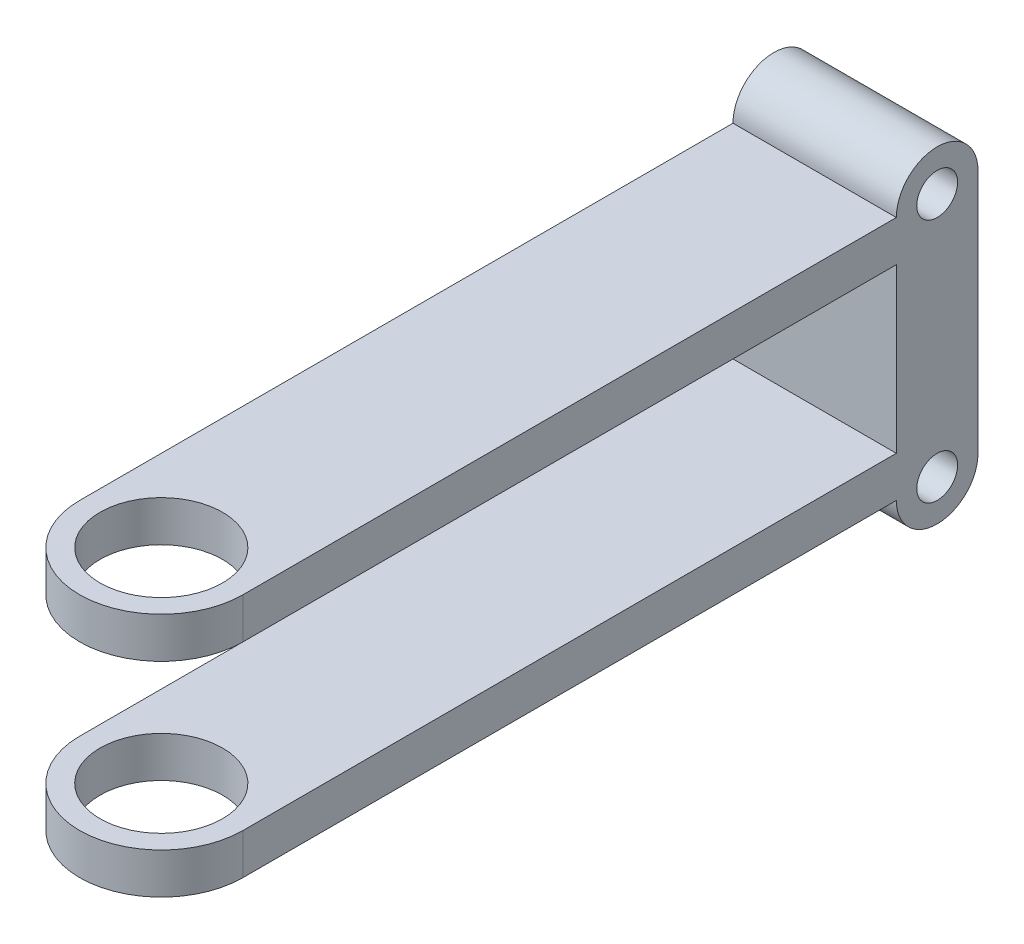
ISO-10303-21;
HEADER;
FILE_DESCRIPTION(('STEP AP214'),'2;1');
FILE_NAME('part.step','',(''),(''),'','','');
FILE_SCHEMA(('AUTOMOTIVE_DESIGN { 1 0 10303 214 1 1 1 1 }'));
ENDSEC;
DATA;
#1=APPLICATION_CONTEXT('core data for automotive mechanical design processes');
#2=APPLICATION_PROTOCOL_DEFINITION('international standard','automotive_design',2000,#1);
#3=PRODUCT_CONTEXT('',#1,'mechanical');
#4=PRODUCT('Part','Part','',(#3));
#5=PRODUCT_RELATED_PRODUCT_CATEGORY('part','',(#4));
#6=PRODUCT_DEFINITION_FORMATION('','',#4);
#7=PRODUCT_DEFINITION_CONTEXT('part definition',#1,'design');
#8=PRODUCT_DEFINITION('design','',#6,#7);
#9=PRODUCT_DEFINITION_SHAPE('','',#8);
#10=(LENGTH_UNIT() NAMED_UNIT(*) SI_UNIT(.MILLI.,.METRE.));
#11=(NAMED_UNIT(*) PLANE_ANGLE_UNIT() SI_UNIT($,.RADIAN.));
#12=(NAMED_UNIT(*) SI_UNIT($,.STERADIAN.) SOLID_ANGLE_UNIT());
#13=UNCERTAINTY_MEASURE_WITH_UNIT(LENGTH_MEASURE(1.E-05),#10,'distance_accuracy_value','');
#14=(GEOMETRIC_REPRESENTATION_CONTEXT(3) GLOBAL_UNCERTAINTY_ASSIGNED_CONTEXT((#13)) GLOBAL_UNIT_ASSIGNED_CONTEXT((#10,
#11,#12)) REPRESENTATION_CONTEXT('',''));
#15=CARTESIAN_POINT('',(0.,0.,0.));
#16=DIRECTION('',(0.,0.,1.));
#17=DIRECTION('',(1.,0.,0.));
#18=AXIS2_PLACEMENT_3D('',#15,#16,#17);
#19=CARTESIAN_POINT('',(20.,0.,-160.));
#20=DIRECTION('',(0.,0.,1.));
#21=DIRECTION('',(1.,0.,0.));
#22=AXIS2_PLACEMENT_3D('',#19,#20,#21);
#23=PLANE('',#22);
#24=DIRECTION('',(0.,1.,0.));
#25=VECTOR('',#24,1.);
#26=CARTESIAN_POINT('',(-20.,0.,-160.));
#27=LINE('',#26,#25);
#28=CARTESIAN_POINT('',(-20.,9.99999999999999,-160.));
#29=VERTEX_POINT('',#28);
#30=CARTESIAN_POINT('',(-20.,50.,-160.));
#31=VERTEX_POINT('',#30);
#32=EDGE_CURVE('E120',#29,#31,#27,.T.);
#33=ORIENTED_EDGE('',*,*,#32,.F.);
#34=DIRECTION('',(1.,0.,0.));
#35=VECTOR('',#34,1.);
#36=CARTESIAN_POINT('',(20.,9.99999999999999,-160.));
#37=LINE('',#36,#35);
#38=CARTESIAN_POINT('',(20.,9.99999999999999,-160.));
#39=VERTEX_POINT('',#38);
#40=EDGE_CURVE('E43',#29,#39,#37,.T.);
#41=ORIENTED_EDGE('',*,*,#40,.T.);
#42=DIRECTION('',(0.,1.,0.));
#43=VECTOR('',#42,1.);
#44=CARTESIAN_POINT('',(20.,0.,-160.));
#45=LINE('',#44,#43);
#46=CARTESIAN_POINT('',(20.,50.,-160.));
#47=VERTEX_POINT('',#46);
#48=EDGE_CURVE('E174',#39,#47,#45,.T.);
#49=ORIENTED_EDGE('',*,*,#48,.T.);
#50=DIRECTION('',(1.,0.,0.));
#51=VECTOR('',#50,1.);
#52=CARTESIAN_POINT('',(20.,50.,-160.));
#53=LINE('',#52,#51);
#54=EDGE_CURVE('E195',#31,#47,#53,.T.);
#55=ORIENTED_EDGE('',*,*,#54,.F.);
#56=EDGE_LOOP('',(#33,#41,#49,#55));
#57=FACE_BOUND('',#56,.T.);
#58=ADVANCED_FACE('F35',(#57),#23,.T.);
#59=CARTESIAN_POINT('',(0.,60.,0.));
#60=DIRECTION('',(0.,-1.,0.));
#61=DIRECTION('',(0.,0.,-1.));
#62=AXIS2_PLACEMENT_3D('',#59,#60,#61);
#63=CYLINDRICAL_SURFACE('',#62,20.);
#64=CARTESIAN_POINT('',(0.,50.,0.));
#65=DIRECTION('',(0.,1.,0.));
#66=DIRECTION('',(0.,0.,1.));
#67=AXIS2_PLACEMENT_3D('',#64,#65,#66);
#68=CIRCLE('',#67,20.);
#69=CARTESIAN_POINT('',(-20.,50.,0.));
#70=VERTEX_POINT('',#69);
#71=CARTESIAN_POINT('',(20.,50.,0.));
#72=VERTEX_POINT('',#71);
#73=EDGE_CURVE('E176',#70,#72,#68,.T.);
#74=ORIENTED_EDGE('',*,*,#73,.T.);
#75=DIRECTION('',(0.,-1.,0.));
#76=VECTOR('',#75,1.);
#77=CARTESIAN_POINT('',(20.,60.,0.));
#78=LINE('',#77,#76);
#79=CARTESIAN_POINT('',(20.,60.,0.));
#80=VERTEX_POINT('',#79);
#81=EDGE_CURVE('E198',#80,#72,#78,.T.);
#82=ORIENTED_EDGE('',*,*,#81,.F.);
#83=CARTESIAN_POINT('',(0.,60.,0.));
#84=DIRECTION('',(0.,1.,0.));
#85=DIRECTION('',(0.,0.,1.));
#86=AXIS2_PLACEMENT_3D('',#83,#84,#85);
#87=CIRCLE('',#86,20.);
#88=CARTESIAN_POINT('',(-20.,60.,0.));
#89=VERTEX_POINT('',#88);
#90=EDGE_CURVE('E185',#89,#80,#87,.T.);
#91=ORIENTED_EDGE('',*,*,#90,.F.);
#92=DIRECTION('',(0.,-1.,0.));
#93=VECTOR('',#92,1.);
#94=CARTESIAN_POINT('',(-20.,60.,0.));
#95=LINE('',#94,#93);
#96=EDGE_CURVE('E192',#89,#70,#95,.T.);
#97=ORIENTED_EDGE('',*,*,#96,.T.);
#98=EDGE_LOOP('',(#74,#82,#91,#97));
#99=FACE_BOUND('',#98,.T.);
#100=ADVANCED_FACE('F222',(#99),#63,.T.);
#101=CARTESIAN_POINT('',(20.,60.,0.));
#102=DIRECTION('',(-1.,0.,0.));
#103=DIRECTION('',(0.,0.,1.));
#104=AXIS2_PLACEMENT_3D('',#101,#102,#103);
#105=PLANE('',#104);
#106=CARTESIAN_POINT('',(20.,0.,-170.));
#107=DIRECTION('',(-1.,0.,0.));
#108=DIRECTION('',(0.,0.,1.));
#109=AXIS2_PLACEMENT_3D('',#106,#107,#108);
#110=CIRCLE('',#109,5.00000000000002);
#111=CARTESIAN_POINT('',(20.,0.,-165.));
#112=VERTEX_POINT('',#111);
#113=EDGE_CURVE('E135',#112,#112,#110,.T.);
#114=ORIENTED_EDGE('',*,*,#113,.T.);
#115=EDGE_LOOP('',(#114));
#116=FACE_BOUND('',#115,.T.);
#117=CARTESIAN_POINT('',(20.,60.,-170.));
#118=DIRECTION('',(-1.,0.,0.));
#119=DIRECTION('',(0.,0.,1.));
#120=AXIS2_PLACEMENT_3D('',#117,#118,#119);
#121=CIRCLE('',#120,5.00000000000002);
#122=CARTESIAN_POINT('',(20.,60.,-165.));
#123=VERTEX_POINT('',#122);
#124=EDGE_CURVE('E259',#123,#123,#121,.T.);
#125=ORIENTED_EDGE('',*,*,#124,.T.);
#126=EDGE_LOOP('',(#125));
#127=FACE_BOUND('',#126,.T.);
#128=DIRECTION('',(0.,1.,0.));
#129=VECTOR('',#128,1.);
#130=CARTESIAN_POINT('',(20.,0.,-180.));
#131=LINE('',#130,#129);
#132=CARTESIAN_POINT('',(20.,0.,-180.));
#133=VERTEX_POINT('',#132);
#134=CARTESIAN_POINT('',(20.,60.,-180.));
#135=VERTEX_POINT('',#134);
#136=EDGE_CURVE('E121',#133,#135,#131,.T.);
#137=ORIENTED_EDGE('',*,*,#136,.T.);
#138=CARTESIAN_POINT('',(20.,60.,-170.));
#139=DIRECTION('',(-1.,0.,0.));
#140=DIRECTION('',(0.,0.,1.));
#141=AXIS2_PLACEMENT_3D('',#138,#139,#140);
#142=CIRCLE('',#141,10.);
#143=CARTESIAN_POINT('',(20.,60.,-160.));
#144=VERTEX_POINT('',#143);
#145=EDGE_CURVE('E128',#144,#135,#142,.T.);
#146=ORIENTED_EDGE('',*,*,#145,.F.);
#147=DIRECTION('',(0.,0.,-1.));
#148=VECTOR('',#147,1.);
#149=CARTESIAN_POINT('',(20.,60.,0.));
#150=LINE('',#149,#148);
#151=EDGE_CURVE('E55',#80,#144,#150,.T.);
#152=ORIENTED_EDGE('',*,*,#151,.F.);
#153=ORIENTED_EDGE('',*,*,#81,.T.);
#154=DIRECTION('',(0.,0.,-1.));
#155=VECTOR('',#154,1.);
#156=CARTESIAN_POINT('',(20.,50.,20.));
#157=LINE('',#156,#155);
#158=EDGE_CURVE('E190',#72,#47,#157,.T.);
#159=ORIENTED_EDGE('',*,*,#158,.T.);
#160=ORIENTED_EDGE('',*,*,#48,.F.);
#161=DIRECTION('',(0.,0.,-1.));
#162=VECTOR('',#161,1.);
#163=CARTESIAN_POINT('',(20.,9.99999999999999,20.));
#164=LINE('',#163,#162);
#165=CARTESIAN_POINT('',(20.,9.99999999999999,0.));
#166=VERTEX_POINT('',#165);
#167=EDGE_CURVE('E147',#166,#39,#164,.T.);
#168=ORIENTED_EDGE('',*,*,#167,.F.);
#169=DIRECTION('',(0.,-1.,0.));
#170=VECTOR('',#169,1.);
#171=CARTESIAN_POINT('',(20.,60.,0.));
#172=LINE('',#171,#170);
#173=CARTESIAN_POINT('',(20.,0.,0.));
#174=VERTEX_POINT('',#173);
#175=EDGE_CURVE('E130',#166,#174,#172,.T.);
#176=ORIENTED_EDGE('',*,*,#175,.T.);
#177=DIRECTION('',(0.,0.,-1.));
#178=VECTOR('',#177,1.);
#179=CARTESIAN_POINT('',(20.,0.,-170.));
#180=LINE('',#179,#178);
#181=CARTESIAN_POINT('',(20.,0.,-160.));
#182=VERTEX_POINT('',#181);
#183=EDGE_CURVE('E129',#174,#182,#180,.T.);
#184=ORIENTED_EDGE('',*,*,#183,.T.);
#185=CARTESIAN_POINT('',(20.,0.,-170.));
#186=DIRECTION('',(-1.,0.,0.));
#187=DIRECTION('',(0.,0.,1.));
#188=AXIS2_PLACEMENT_3D('',#185,#186,#187);
#189=CIRCLE('',#188,10.);
#190=EDGE_CURVE('E145',#133,#182,#189,.T.);
#191=ORIENTED_EDGE('',*,*,#190,.F.);
#192=EDGE_LOOP('',(#137,#146,#152,#153,#159,#160,#168,#176,#184,#191));
#193=FACE_BOUND('',#192,.T.);
#194=ADVANCED_FACE('F213',(#116,#127,#193),#105,.F.);
#195=CARTESIAN_POINT('',(-20.,60.,0.));
#196=DIRECTION('',(1.,0.,0.));
#197=DIRECTION('',(0.,0.,-1.));
#198=AXIS2_PLACEMENT_3D('',#195,#196,#197);
#199=PLANE('',#198);
#200=CARTESIAN_POINT('',(-20.,0.,-170.));
#201=DIRECTION('',(-1.,0.,0.));
#202=DIRECTION('',(0.,0.,1.));
#203=AXIS2_PLACEMENT_3D('',#200,#201,#202);
#204=CIRCLE('',#203,5.00000000000002);
#205=CARTESIAN_POINT('',(-20.,0.,-165.));
#206=VERTEX_POINT('',#205);
#207=EDGE_CURVE('E139',#206,#206,#204,.T.);
#208=ORIENTED_EDGE('',*,*,#207,.F.);
#209=EDGE_LOOP('',(#208));
#210=FACE_BOUND('',#209,.T.);
#211=CARTESIAN_POINT('',(-20.,60.,-170.));
#212=DIRECTION('',(-1.,0.,0.));
#213=DIRECTION('',(0.,0.,1.));
#214=AXIS2_PLACEMENT_3D('',#211,#212,#213);
#215=CIRCLE('',#214,5.00000000000002);
#216=CARTESIAN_POINT('',(-20.,60.,-165.));
#217=VERTEX_POINT('',#216);
#218=EDGE_CURVE('E261',#217,#217,#215,.T.);
#219=ORIENTED_EDGE('',*,*,#218,.F.);
#220=EDGE_LOOP('',(#219));
#221=FACE_BOUND('',#220,.T.);
#222=DIRECTION('',(0.,0.,1.));
#223=VECTOR('',#222,1.);
#224=CARTESIAN_POINT('',(-20.,60.,0.));
#225=LINE('',#224,#223);
#226=CARTESIAN_POINT('',(-20.,60.,-160.));
#227=VERTEX_POINT('',#226);
#228=EDGE_CURVE('E134',#227,#89,#225,.T.);
#229=ORIENTED_EDGE('',*,*,#228,.F.);
#230=CARTESIAN_POINT('',(-20.,60.,-170.));
#231=DIRECTION('',(-1.,0.,0.));
#232=DIRECTION('',(0.,0.,1.));
#233=AXIS2_PLACEMENT_3D('',#230,#231,#232);
#234=CIRCLE('',#233,10.);
#235=CARTESIAN_POINT('',(-20.,60.,-180.));
#236=VERTEX_POINT('',#235);
#237=EDGE_CURVE('E126',#227,#236,#234,.T.);
#238=ORIENTED_EDGE('',*,*,#237,.T.);
#239=DIRECTION('',(0.,1.,0.));
#240=VECTOR('',#239,1.);
#241=CARTESIAN_POINT('',(-20.,0.,-180.));
#242=LINE('',#241,#240);
#243=CARTESIAN_POINT('',(-20.,0.,-180.));
#244=VERTEX_POINT('',#243);
#245=EDGE_CURVE('E111',#244,#236,#242,.T.);
#246=ORIENTED_EDGE('',*,*,#245,.F.);
#247=CARTESIAN_POINT('',(-20.,0.,-170.));
#248=DIRECTION('',(-1.,0.,0.));
#249=DIRECTION('',(0.,0.,1.));
#250=AXIS2_PLACEMENT_3D('',#247,#248,#249);
#251=CIRCLE('',#250,10.);
#252=CARTESIAN_POINT('',(-20.,0.,-160.));
#253=VERTEX_POINT('',#252);
#254=EDGE_CURVE('E144',#244,#253,#251,.T.);
#255=ORIENTED_EDGE('',*,*,#254,.T.);
#256=DIRECTION('',(0.,0.,1.));
#257=VECTOR('',#256,1.);
#258=CARTESIAN_POINT('',(-20.,0.,-170.));
#259=LINE('',#258,#257);
#260=CARTESIAN_POINT('',(-20.,0.,0.));
#261=VERTEX_POINT('',#260);
#262=EDGE_CURVE('E172',#253,#261,#259,.T.);
#263=ORIENTED_EDGE('',*,*,#262,.T.);
#264=DIRECTION('',(0.,-1.,0.));
#265=VECTOR('',#264,1.);
#266=CARTESIAN_POINT('',(-20.,60.,0.));
#267=LINE('',#266,#265);
#268=CARTESIAN_POINT('',(-20.,9.99999999999999,0.));
#269=VERTEX_POINT('',#268);
#270=EDGE_CURVE('E162',#269,#261,#267,.T.);
#271=ORIENTED_EDGE('',*,*,#270,.F.);
#272=DIRECTION('',(0.,0.,-1.));
#273=VECTOR('',#272,1.);
#274=CARTESIAN_POINT('',(-20.,9.99999999999999,20.));
#275=LINE('',#274,#273);
#276=EDGE_CURVE('E149',#269,#29,#275,.T.);
#277=ORIENTED_EDGE('',*,*,#276,.T.);
#278=ORIENTED_EDGE('',*,*,#32,.T.);
#279=DIRECTION('',(0.,0.,-1.));
#280=VECTOR('',#279,1.);
#281=CARTESIAN_POINT('',(-20.,50.,20.));
#282=LINE('',#281,#280);
#283=EDGE_CURVE('E182',#70,#31,#282,.T.);
#284=ORIENTED_EDGE('',*,*,#283,.F.);
#285=ORIENTED_EDGE('',*,*,#96,.F.);
#286=EDGE_LOOP('',(#229,#238,#246,#255,#263,#271,#277,#278,#284,#285));
#287=FACE_BOUND('',#286,.T.);
#288=ADVANCED_FACE('F132',(#210,#221,#287),#199,.F.);
#289=CARTESIAN_POINT('',(0.,60.,0.));
#290=DIRECTION('',(0.,-1.,0.));
#291=DIRECTION('',(0.,0.,-1.));
#292=AXIS2_PLACEMENT_3D('',#289,#290,#291);
#293=CYLINDRICAL_SURFACE('',#292,15.);
#294=CARTESIAN_POINT('',(0.,50.,0.));
#295=DIRECTION('',(0.,1.,0.));
#296=DIRECTION('',(0.,0.,1.));
#297=AXIS2_PLACEMENT_3D('',#294,#295,#296);
#298=CIRCLE('',#297,15.);
#299=CARTESIAN_POINT('',(0.,50.,15.));
#300=VERTEX_POINT('',#299);
#301=EDGE_CURVE('E179',#300,#300,#298,.T.);
#302=ORIENTED_EDGE('',*,*,#301,.F.);
#303=EDGE_LOOP('',(#302));
#304=FACE_BOUND('',#303,.T.);
#305=CARTESIAN_POINT('',(0.,60.,0.));
#306=DIRECTION('',(0.,1.,0.));
#307=DIRECTION('',(0.,0.,1.));
#308=AXIS2_PLACEMENT_3D('',#305,#306,#307);
#309=CIRCLE('',#308,15.);
#310=CARTESIAN_POINT('',(0.,60.,15.));
#311=VERTEX_POINT('',#310);
#312=EDGE_CURVE('E187',#311,#311,#309,.T.);
#313=ORIENTED_EDGE('',*,*,#312,.T.);
#314=EDGE_LOOP('',(#313));
#315=FACE_BOUND('',#314,.T.);
#316=ADVANCED_FACE('F37',(#304,#315),#293,.F.);
#317=CARTESIAN_POINT('',(0.,60.,0.));
#318=DIRECTION('',(0.,1.,0.));
#319=DIRECTION('',(0.,0.,1.));
#320=AXIS2_PLACEMENT_3D('',#317,#318,#319);
#321=PLANE('',#320);
#322=DIRECTION('',(-1.,0.,0.));
#323=VECTOR('',#322,1.);
#324=CARTESIAN_POINT('',(20.,60.,-160.));
#325=LINE('',#324,#323);
#326=EDGE_CURVE('E50',#227,#144,#325,.F.);
#327=ORIENTED_EDGE('',*,*,#326,.F.);
#328=ORIENTED_EDGE('',*,*,#228,.T.);
#329=ORIENTED_EDGE('',*,*,#90,.T.);
#330=ORIENTED_EDGE('',*,*,#151,.T.);
#331=EDGE_LOOP('',(#327,#328,#329,#330));
#332=FACE_BOUND('',#331,.T.);
#333=ORIENTED_EDGE('',*,*,#312,.F.);
#334=EDGE_LOOP('',(#333));
#335=FACE_BOUND('',#334,.T.);
#336=ADVANCED_FACE('F223',(#332,#335),#321,.T.);
#337=CARTESIAN_POINT('',(20.,50.,20.));
#338=DIRECTION('',(0.,1.,0.));
#339=DIRECTION('',(0.,0.,1.));
#340=AXIS2_PLACEMENT_3D('',#337,#338,#339);
#341=PLANE('',#340);
#342=ORIENTED_EDGE('',*,*,#301,.T.);
#343=EDGE_LOOP('',(#342));
#344=FACE_BOUND('',#343,.T.);
#345=ORIENTED_EDGE('',*,*,#283,.T.);
#346=ORIENTED_EDGE('',*,*,#54,.T.);
#347=ORIENTED_EDGE('',*,*,#158,.F.);
#348=ORIENTED_EDGE('',*,*,#73,.F.);
#349=EDGE_LOOP('',(#345,#346,#347,#348));
#350=FACE_BOUND('',#349,.T.);
#351=ADVANCED_FACE('F218',(#344,#350),#341,.F.);
#352=CARTESIAN_POINT('',(20.,0.,-180.));
#353=DIRECTION('',(0.,0.,-1.));
#354=DIRECTION('',(-1.,0.,0.));
#355=AXIS2_PLACEMENT_3D('',#352,#353,#354);
#356=PLANE('',#355);
#357=ORIENTED_EDGE('',*,*,#245,.T.);
#358=DIRECTION('',(-1.,0.,0.));
#359=VECTOR('',#358,1.);
#360=CARTESIAN_POINT('',(20.,60.,-180.));
#361=LINE('',#360,#359);
#362=EDGE_CURVE('E115',#135,#236,#361,.T.);
#363=ORIENTED_EDGE('',*,*,#362,.F.);
#364=ORIENTED_EDGE('',*,*,#136,.F.);
#365=DIRECTION('',(-1.,0.,0.));
#366=VECTOR('',#365,1.);
#367=CARTESIAN_POINT('',(20.,0.,-180.));
#368=LINE('',#367,#366);
#369=EDGE_CURVE('E117',#133,#244,#368,.T.);
#370=ORIENTED_EDGE('',*,*,#369,.T.);
#371=EDGE_LOOP('',(#357,#363,#364,#370));
#372=FACE_BOUND('',#371,.T.);
#373=ADVANCED_FACE('F113',(#372),#356,.T.);
#374=CARTESIAN_POINT('',(0.,0.,0.));
#375=DIRECTION('',(0.,1.,0.));
#376=DIRECTION('',(0.,0.,1.));
#377=AXIS2_PLACEMENT_3D('',#374,#375,#376);
#378=PLANE('',#377);
#379=ORIENTED_EDGE('',*,*,#262,.F.);
#380=DIRECTION('',(-1.,0.,0.));
#381=VECTOR('',#380,1.);
#382=CARTESIAN_POINT('',(20.,0.,-160.));
#383=LINE('',#382,#381);
#384=EDGE_CURVE('E11',#253,#182,#383,.F.);
#385=ORIENTED_EDGE('',*,*,#384,.T.);
#386=ORIENTED_EDGE('',*,*,#183,.F.);
#387=CARTESIAN_POINT('',(0.,0.,0.));
#388=DIRECTION('',(0.,1.,0.));
#389=DIRECTION('',(0.,0.,1.));
#390=AXIS2_PLACEMENT_3D('',#387,#388,#389);
#391=CIRCLE('',#390,20.);
#392=EDGE_CURVE('E159',#261,#174,#391,.T.);
#393=ORIENTED_EDGE('',*,*,#392,.F.);
#394=EDGE_LOOP('',(#379,#385,#386,#393));
#395=FACE_BOUND('',#394,.T.);
#396=CARTESIAN_POINT('',(0.,0.,0.));
#397=DIRECTION('',(0.,1.,0.));
#398=DIRECTION('',(0.,0.,1.));
#399=AXIS2_PLACEMENT_3D('',#396,#397,#398);
#400=CIRCLE('',#399,15.);
#401=CARTESIAN_POINT('',(0.,0.,15.));
#402=VERTEX_POINT('',#401);
#403=EDGE_CURVE('E156',#402,#402,#400,.T.);
#404=ORIENTED_EDGE('',*,*,#403,.T.);
#405=EDGE_LOOP('',(#404));
#406=FACE_BOUND('',#405,.T.);
#407=ADVANCED_FACE('F244',(#395,#406),#378,.F.);
#408=CARTESIAN_POINT('',(0.,60.,0.));
#409=DIRECTION('',(0.,-1.,0.));
#410=DIRECTION('',(0.,0.,-1.));
#411=AXIS2_PLACEMENT_3D('',#408,#409,#410);
#412=CYLINDRICAL_SURFACE('',#411,20.);
#413=ORIENTED_EDGE('',*,*,#175,.F.);
#414=CARTESIAN_POINT('',(0.,9.99999999999999,0.));
#415=DIRECTION('',(0.,-1.,0.));
#416=DIRECTION('',(0.,0.,-1.));
#417=AXIS2_PLACEMENT_3D('',#414,#415,#416);
#418=CIRCLE('',#417,20.);
#419=EDGE_CURVE('E154',#166,#269,#418,.T.);
#420=ORIENTED_EDGE('',*,*,#419,.T.);
#421=ORIENTED_EDGE('',*,*,#270,.T.);
#422=ORIENTED_EDGE('',*,*,#392,.T.);
#423=EDGE_LOOP('',(#413,#420,#421,#422));
#424=FACE_BOUND('',#423,.T.);
#425=ADVANCED_FACE('F290',(#424),#412,.T.);
#426=CARTESIAN_POINT('',(0.,60.,0.));
#427=DIRECTION('',(0.,-1.,0.));
#428=DIRECTION('',(0.,0.,-1.));
#429=AXIS2_PLACEMENT_3D('',#426,#427,#428);
#430=CYLINDRICAL_SURFACE('',#429,15.);
#431=CARTESIAN_POINT('',(0.,9.99999999999999,0.));
#432=DIRECTION('',(0.,-1.,0.));
#433=DIRECTION('',(0.,0.,-1.));
#434=AXIS2_PLACEMENT_3D('',#431,#432,#433);
#435=CIRCLE('',#434,15.);
#436=CARTESIAN_POINT('',(0.,9.99999999999999,-15.));
#437=VERTEX_POINT('',#436);
#438=EDGE_CURVE('E152',#437,#437,#435,.T.);
#439=ORIENTED_EDGE('',*,*,#438,.F.);
#440=EDGE_LOOP('',(#439));
#441=FACE_BOUND('',#440,.T.);
#442=ORIENTED_EDGE('',*,*,#403,.F.);
#443=EDGE_LOOP('',(#442));
#444=FACE_BOUND('',#443,.T.);
#445=ADVANCED_FACE('F288',(#441,#444),#430,.F.);
#446=CARTESIAN_POINT('',(20.,9.99999999999999,20.));
#447=DIRECTION('',(0.,-1.,0.));
#448=DIRECTION('',(0.,0.,-1.));
#449=AXIS2_PLACEMENT_3D('',#446,#447,#448);
#450=PLANE('',#449);
#451=ORIENTED_EDGE('',*,*,#40,.F.);
#452=ORIENTED_EDGE('',*,*,#276,.F.);
#453=ORIENTED_EDGE('',*,*,#419,.F.);
#454=ORIENTED_EDGE('',*,*,#167,.T.);
#455=EDGE_LOOP('',(#451,#452,#453,#454));
#456=FACE_BOUND('',#455,.T.);
#457=ORIENTED_EDGE('',*,*,#438,.T.);
#458=EDGE_LOOP('',(#457));
#459=FACE_BOUND('',#458,.T.);
#460=ADVANCED_FACE('F284',(#456,#459),#450,.F.);
#461=CARTESIAN_POINT('',(20.,0.,-170.));
#462=DIRECTION('',(-1.,0.,0.));
#463=DIRECTION('',(0.,0.,1.));
#464=AXIS2_PLACEMENT_3D('',#461,#462,#463);
#465=CYLINDRICAL_SURFACE('',#464,10.);
#466=ORIENTED_EDGE('',*,*,#369,.F.);
#467=ORIENTED_EDGE('',*,*,#190,.T.);
#468=ORIENTED_EDGE('',*,*,#384,.F.);
#469=ORIENTED_EDGE('',*,*,#254,.F.);
#470=EDGE_LOOP('',(#466,#467,#468,#469));
#471=FACE_BOUND('',#470,.T.);
#472=ADVANCED_FACE('F279',(#471),#465,.T.);
#473=CARTESIAN_POINT('',(20.,60.,-170.));
#474=DIRECTION('',(-1.,0.,0.));
#475=DIRECTION('',(0.,0.,1.));
#476=AXIS2_PLACEMENT_3D('',#473,#474,#475);
#477=CYLINDRICAL_SURFACE('',#476,10.);
#478=ORIENTED_EDGE('',*,*,#237,.F.);
#479=ORIENTED_EDGE('',*,*,#326,.T.);
#480=ORIENTED_EDGE('',*,*,#145,.T.);
#481=ORIENTED_EDGE('',*,*,#362,.T.);
#482=EDGE_LOOP('',(#478,#479,#480,#481));
#483=FACE_BOUND('',#482,.T.);
#484=ADVANCED_FACE('F125',(#483),#477,.T.);
#485=CARTESIAN_POINT('',(20.,60.,-170.));
#486=DIRECTION('',(-1.,0.,0.));
#487=DIRECTION('',(0.,0.,1.));
#488=AXIS2_PLACEMENT_3D('',#485,#486,#487);
#489=CYLINDRICAL_SURFACE('',#488,5.00000000000002);
#490=ORIENTED_EDGE('',*,*,#124,.F.);
#491=EDGE_LOOP('',(#490));
#492=FACE_BOUND('',#491,.T.);
#493=ORIENTED_EDGE('',*,*,#218,.T.);
#494=EDGE_LOOP('',(#493));
#495=FACE_BOUND('',#494,.T.);
#496=ADVANCED_FACE('F268',(#492,#495),#489,.F.);
#497=CARTESIAN_POINT('',(20.,0.,-170.));
#498=DIRECTION('',(-1.,0.,0.));
#499=DIRECTION('',(0.,0.,1.));
#500=AXIS2_PLACEMENT_3D('',#497,#498,#499);
#501=CYLINDRICAL_SURFACE('',#500,5.00000000000002);
#502=ORIENTED_EDGE('',*,*,#113,.F.);
#503=EDGE_LOOP('',(#502));
#504=FACE_BOUND('',#503,.T.);
#505=ORIENTED_EDGE('',*,*,#207,.T.);
#506=EDGE_LOOP('',(#505));
#507=FACE_BOUND('',#506,.T.);
#508=ADVANCED_FACE('F271',(#504,#507),#501,.F.);
#509=CLOSED_SHELL('',(#58,#100,#194,#288,#316,#336,#351,#373,#407,#425,#445,#460,#472,#484,#496,#508));
#510=MANIFOLD_SOLID_BREP('B2',#509);
#511=ADVANCED_BREP_SHAPE_REPRESENTATION('',(#18,#510),#14);
#512=SHAPE_DEFINITION_REPRESENTATION(#9,#511);
ENDSEC;
END-ISO-10303-21;
